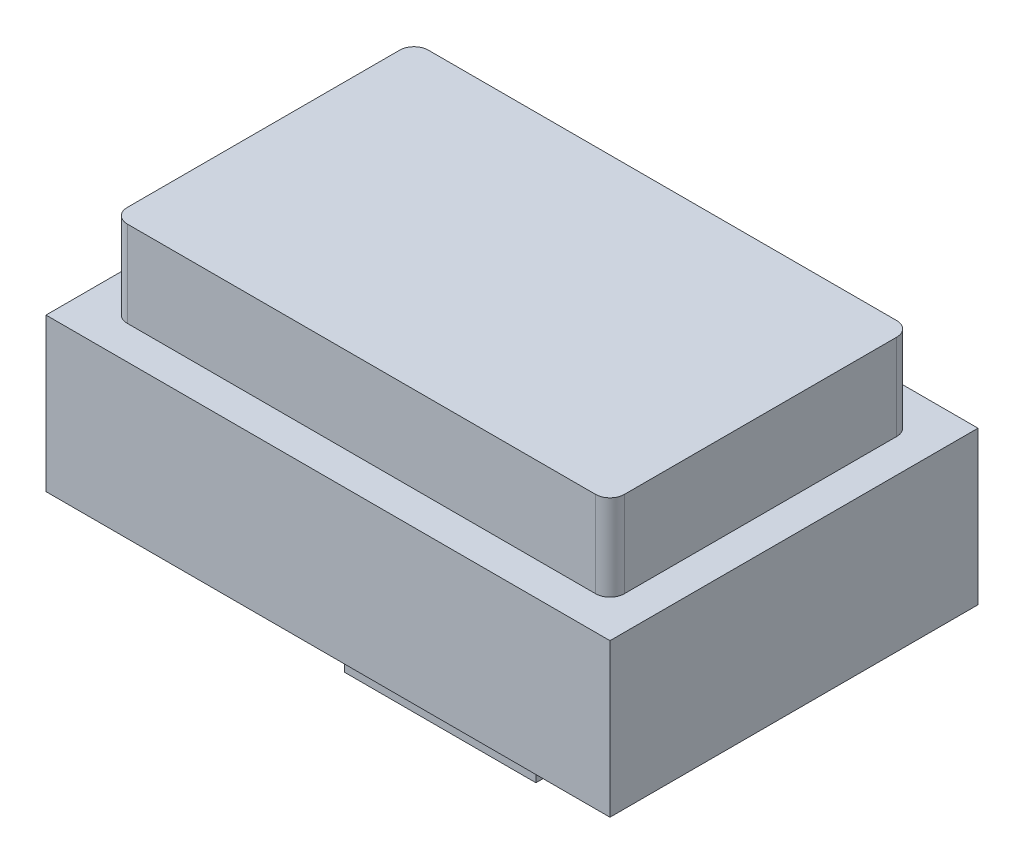
ISO-10303-21;
HEADER;
FILE_DESCRIPTION(('STEP AP214'),'2;1');
FILE_NAME('part.step','',(''),(''),'','','');
FILE_SCHEMA(('AUTOMOTIVE_DESIGN { 1 0 10303 214 1 1 1 1 }'));
ENDSEC;
DATA;
#1=APPLICATION_CONTEXT('core data for automotive mechanical design processes');
#2=APPLICATION_PROTOCOL_DEFINITION('international standard','automotive_design',2000,#1);
#3=PRODUCT_CONTEXT('',#1,'mechanical');
#4=PRODUCT('Part','Part','',(#3));
#5=PRODUCT_RELATED_PRODUCT_CATEGORY('part','',(#4));
#6=PRODUCT_DEFINITION_FORMATION('','',#4);
#7=PRODUCT_DEFINITION_CONTEXT('part definition',#1,'design');
#8=PRODUCT_DEFINITION('design','',#6,#7);
#9=PRODUCT_DEFINITION_SHAPE('','',#8);
#10=(LENGTH_UNIT() NAMED_UNIT(*) SI_UNIT(.MILLI.,.METRE.));
#11=(NAMED_UNIT(*) PLANE_ANGLE_UNIT() SI_UNIT($,.RADIAN.));
#12=(NAMED_UNIT(*) SI_UNIT($,.STERADIAN.) SOLID_ANGLE_UNIT());
#13=UNCERTAINTY_MEASURE_WITH_UNIT(LENGTH_MEASURE(1.E-05),#10,'distance_accuracy_value','');
#14=(GEOMETRIC_REPRESENTATION_CONTEXT(3) GLOBAL_UNCERTAINTY_ASSIGNED_CONTEXT((#13)) GLOBAL_UNIT_ASSIGNED_CONTEXT((#10,
#11,#12)) REPRESENTATION_CONTEXT('',''));
#15=CARTESIAN_POINT('',(0.,0.,0.));
#16=DIRECTION('',(0.,0.,1.));
#17=DIRECTION('',(1.,0.,0.));
#18=AXIS2_PLACEMENT_3D('',#15,#16,#17);
#19=CARTESIAN_POINT('',(0.,-3.2,0.));
#20=DIRECTION('',(0.,-1.,0.));
#21=DIRECTION('',(0.,0.,-1.));
#22=AXIS2_PLACEMENT_3D('',#19,#20,#21);
#23=PLANE('',#22);
#24=DIRECTION('',(0.,0.,1.));
#25=VECTOR('',#24,1.);
#26=CARTESIAN_POINT('',(5.9,-3.2,3.85));
#27=LINE('',#26,#25);
#28=CARTESIAN_POINT('',(5.9,-3.2,-3.85));
#29=VERTEX_POINT('',#28);
#30=CARTESIAN_POINT('',(5.9,-3.2,3.85));
#31=VERTEX_POINT('',#30);
#32=EDGE_CURVE('E178',#29,#31,#27,.T.);
#33=ORIENTED_EDGE('',*,*,#32,.T.);
#34=DIRECTION('',(-1.,0.,0.));
#35=VECTOR('',#34,1.);
#36=CARTESIAN_POINT('',(-5.9,-3.2,3.85));
#37=LINE('',#36,#35);
#38=CARTESIAN_POINT('',(-5.9,-3.2,3.85));
#39=VERTEX_POINT('',#38);
#40=EDGE_CURVE('E181',#31,#39,#37,.T.);
#41=ORIENTED_EDGE('',*,*,#40,.T.);
#42=DIRECTION('',(0.,0.,-1.));
#43=VECTOR('',#42,1.);
#44=CARTESIAN_POINT('',(-5.9,-3.2,3.85));
#45=LINE('',#44,#43);
#46=CARTESIAN_POINT('',(-5.9,-3.2,-3.85));
#47=VERTEX_POINT('',#46);
#48=EDGE_CURVE('E184',#39,#47,#45,.T.);
#49=ORIENTED_EDGE('',*,*,#48,.T.);
#50=DIRECTION('',(1.,0.,0.));
#51=VECTOR('',#50,1.);
#52=CARTESIAN_POINT('',(-5.9,-3.2,-3.85));
#53=LINE('',#52,#51);
#54=EDGE_CURVE('E186',#47,#29,#53,.T.);
#55=ORIENTED_EDGE('',*,*,#54,.T.);
#56=EDGE_LOOP('',(#33,#41,#49,#55));
#57=FACE_BOUND('',#56,.T.);
#58=DIRECTION('',(-1.,0.,0.));
#59=VECTOR('',#58,1.);
#60=CARTESIAN_POINT('',(-2.,-3.2,1.5));
#61=LINE('',#60,#59);
#62=CARTESIAN_POINT('',(2.,-3.2,1.5));
#63=VERTEX_POINT('',#62);
#64=CARTESIAN_POINT('',(-2.,-3.2,1.5));
#65=VERTEX_POINT('',#64);
#66=EDGE_CURVE('E459',#63,#65,#61,.T.);
#67=ORIENTED_EDGE('',*,*,#66,.F.);
#68=DIRECTION('',(0.,0.,1.));
#69=VECTOR('',#68,1.);
#70=CARTESIAN_POINT('',(2.,-3.2,1.5));
#71=LINE('',#70,#69);
#72=CARTESIAN_POINT('',(2.,-3.2,-1.5));
#73=VERTEX_POINT('',#72);
#74=EDGE_CURVE('E168',#73,#63,#71,.T.);
#75=ORIENTED_EDGE('',*,*,#74,.F.);
#76=DIRECTION('',(1.,0.,0.));
#77=VECTOR('',#76,1.);
#78=CARTESIAN_POINT('',(-2.,-3.2,-1.5));
#79=LINE('',#78,#77);
#80=CARTESIAN_POINT('',(-2.,-3.2,-1.5));
#81=VERTEX_POINT('',#80);
#82=EDGE_CURVE('E164',#81,#73,#79,.T.);
#83=ORIENTED_EDGE('',*,*,#82,.F.);
#84=DIRECTION('',(0.,0.,-1.));
#85=VECTOR('',#84,1.);
#86=CARTESIAN_POINT('',(-2.,-3.2,1.5));
#87=LINE('',#86,#85);
#88=EDGE_CURVE('E456',#65,#81,#87,.T.);
#89=ORIENTED_EDGE('',*,*,#88,.F.);
#90=EDGE_LOOP('',(#67,#75,#83,#89));
#91=FACE_BOUND('',#90,.T.);
#92=ADVANCED_FACE('F32',(#57,#91),#23,.T.);
#93=CARTESIAN_POINT('',(5.2,1.8,-3.15));
#94=DIRECTION('',(-1.,0.,0.));
#95=DIRECTION('',(0.,0.,1.));
#96=AXIS2_PLACEMENT_3D('',#93,#94,#95);
#97=PLANE('',#96);
#98=DIRECTION('',(0.,0.,-1.));
#99=VECTOR('',#98,1.);
#100=CARTESIAN_POINT('',(5.2,1.8,-3.15));
#101=LINE('',#100,#99);
#102=CARTESIAN_POINT('',(5.2,1.8,2.85));
#103=VERTEX_POINT('',#102);
#104=CARTESIAN_POINT('',(5.2,1.8,-2.85));
#105=VERTEX_POINT('',#104);
#106=EDGE_CURVE('E205',#103,#105,#101,.T.);
#107=ORIENTED_EDGE('',*,*,#106,.F.);
#108=DIRECTION('',(0.,-1.,0.));
#109=VECTOR('',#108,1.);
#110=CARTESIAN_POINT('',(5.2,1.8,2.85));
#111=LINE('',#110,#109);
#112=CARTESIAN_POINT('',(5.2,0.,2.85));
#113=VERTEX_POINT('',#112);
#114=EDGE_CURVE('E255',#103,#113,#111,.T.);
#115=ORIENTED_EDGE('',*,*,#114,.T.);
#116=DIRECTION('',(0.,0.,-1.));
#117=VECTOR('',#116,1.);
#118=CARTESIAN_POINT('',(5.2,0.,-3.15));
#119=LINE('',#118,#117);
#120=CARTESIAN_POINT('',(5.2,0.,-2.85));
#121=VERTEX_POINT('',#120);
#122=EDGE_CURVE('E204',#113,#121,#119,.T.);
#123=ORIENTED_EDGE('',*,*,#122,.T.);
#124=DIRECTION('',(0.,-1.,0.));
#125=VECTOR('',#124,1.);
#126=CARTESIAN_POINT('',(5.2,1.8,-2.85));
#127=LINE('',#126,#125);
#128=EDGE_CURVE('E253',#121,#105,#127,.F.);
#129=ORIENTED_EDGE('',*,*,#128,.T.);
#130=EDGE_LOOP('',(#107,#115,#123,#129));
#131=FACE_BOUND('',#130,.T.);
#132=ADVANCED_FACE('F261',(#131),#97,.F.);
#133=CARTESIAN_POINT('',(-5.2,1.8,-3.15));
#134=DIRECTION('',(0.,0.,1.));
#135=DIRECTION('',(1.,0.,0.));
#136=AXIS2_PLACEMENT_3D('',#133,#134,#135);
#137=PLANE('',#136);
#138=DIRECTION('',(-1.,0.,0.));
#139=VECTOR('',#138,1.);
#140=CARTESIAN_POINT('',(-5.2,1.8,-3.15));
#141=LINE('',#140,#139);
#142=CARTESIAN_POINT('',(4.9,1.8,-3.15));
#143=VERTEX_POINT('',#142);
#144=CARTESIAN_POINT('',(-4.9,1.8,-3.15));
#145=VERTEX_POINT('',#144);
#146=EDGE_CURVE('E208',#143,#145,#141,.T.);
#147=ORIENTED_EDGE('',*,*,#146,.F.);
#148=DIRECTION('',(0.,-1.,0.));
#149=VECTOR('',#148,1.);
#150=CARTESIAN_POINT('',(4.9,1.8,-3.15));
#151=LINE('',#150,#149);
#152=CARTESIAN_POINT('',(4.9,0.,-3.15));
#153=VERTEX_POINT('',#152);
#154=EDGE_CURVE('E11',#143,#153,#151,.T.);
#155=ORIENTED_EDGE('',*,*,#154,.T.);
#156=DIRECTION('',(-1.,0.,0.));
#157=VECTOR('',#156,1.);
#158=CARTESIAN_POINT('',(-5.2,0.,-3.15));
#159=LINE('',#158,#157);
#160=CARTESIAN_POINT('',(-4.9,0.,-3.15));
#161=VERTEX_POINT('',#160);
#162=EDGE_CURVE('E219',#153,#161,#159,.T.);
#163=ORIENTED_EDGE('',*,*,#162,.T.);
#164=DIRECTION('',(0.,-1.,0.));
#165=VECTOR('',#164,1.);
#166=CARTESIAN_POINT('',(-4.9,1.8,-3.15));
#167=LINE('',#166,#165);
#168=EDGE_CURVE('E40',#161,#145,#167,.F.);
#169=ORIENTED_EDGE('',*,*,#168,.T.);
#170=EDGE_LOOP('',(#147,#155,#163,#169));
#171=FACE_BOUND('',#170,.T.);
#172=ADVANCED_FACE('F274',(#171),#137,.F.);
#173=CARTESIAN_POINT('',(-5.2,1.8,-3.15));
#174=DIRECTION('',(1.,0.,0.));
#175=DIRECTION('',(0.,0.,-1.));
#176=AXIS2_PLACEMENT_3D('',#173,#174,#175);
#177=PLANE('',#176);
#178=DIRECTION('',(0.,0.,1.));
#179=VECTOR('',#178,1.);
#180=CARTESIAN_POINT('',(-5.2,0.,-3.15));
#181=LINE('',#180,#179);
#182=CARTESIAN_POINT('',(-5.2,0.,-2.85));
#183=VERTEX_POINT('',#182);
#184=CARTESIAN_POINT('',(-5.2,0.,2.85));
#185=VERTEX_POINT('',#184);
#186=EDGE_CURVE('E221',#183,#185,#181,.T.);
#187=ORIENTED_EDGE('',*,*,#186,.T.);
#188=DIRECTION('',(0.,-1.,0.));
#189=VECTOR('',#188,1.);
#190=CARTESIAN_POINT('',(-5.2,1.8,2.85));
#191=LINE('',#190,#189);
#192=CARTESIAN_POINT('',(-5.2,1.8,2.85));
#193=VERTEX_POINT('',#192);
#194=EDGE_CURVE('E243',#185,#193,#191,.F.);
#195=ORIENTED_EDGE('',*,*,#194,.T.);
#196=DIRECTION('',(0.,0.,1.));
#197=VECTOR('',#196,1.);
#198=CARTESIAN_POINT('',(-5.2,1.8,-3.15));
#199=LINE('',#198,#197);
#200=CARTESIAN_POINT('',(-5.2,1.8,-2.85));
#201=VERTEX_POINT('',#200);
#202=EDGE_CURVE('E211',#201,#193,#199,.T.);
#203=ORIENTED_EDGE('',*,*,#202,.F.);
#204=DIRECTION('',(0.,-1.,0.));
#205=VECTOR('',#204,1.);
#206=CARTESIAN_POINT('',(-5.2,1.8,-2.85));
#207=LINE('',#206,#205);
#208=EDGE_CURVE('E240',#201,#183,#207,.T.);
#209=ORIENTED_EDGE('',*,*,#208,.T.);
#210=EDGE_LOOP('',(#187,#195,#203,#209));
#211=FACE_BOUND('',#210,.T.);
#212=ADVANCED_FACE('F283',(#211),#177,.F.);
#213=CARTESIAN_POINT('',(-5.2,1.8,3.15));
#214=DIRECTION('',(0.,0.,-1.));
#215=DIRECTION('',(-1.,0.,0.));
#216=AXIS2_PLACEMENT_3D('',#213,#214,#215);
#217=PLANE('',#216);
#218=DIRECTION('',(1.,0.,0.));
#219=VECTOR('',#218,1.);
#220=CARTESIAN_POINT('',(-5.2,1.8,3.15));
#221=LINE('',#220,#219);
#222=CARTESIAN_POINT('',(-4.9,1.8,3.15));
#223=VERTEX_POINT('',#222);
#224=CARTESIAN_POINT('',(4.9,1.8,3.15));
#225=VERTEX_POINT('',#224);
#226=EDGE_CURVE('E214',#223,#225,#221,.T.);
#227=ORIENTED_EDGE('',*,*,#226,.F.);
#228=DIRECTION('',(0.,-1.,0.));
#229=VECTOR('',#228,1.);
#230=CARTESIAN_POINT('',(-4.9,1.8,3.15));
#231=LINE('',#230,#229);
#232=CARTESIAN_POINT('',(-4.9,0.,3.15));
#233=VERTEX_POINT('',#232);
#234=EDGE_CURVE('E225',#223,#233,#231,.T.);
#235=ORIENTED_EDGE('',*,*,#234,.T.);
#236=DIRECTION('',(1.,0.,0.));
#237=VECTOR('',#236,1.);
#238=CARTESIAN_POINT('',(-5.2,0.,3.15));
#239=LINE('',#238,#237);
#240=CARTESIAN_POINT('',(4.9,0.,3.15));
#241=VERTEX_POINT('',#240);
#242=EDGE_CURVE('E209',#233,#241,#239,.T.);
#243=ORIENTED_EDGE('',*,*,#242,.T.);
#244=DIRECTION('',(0.,-1.,0.));
#245=VECTOR('',#244,1.);
#246=CARTESIAN_POINT('',(4.9,1.8,3.15));
#247=LINE('',#246,#245);
#248=EDGE_CURVE('E217',#241,#225,#247,.F.);
#249=ORIENTED_EDGE('',*,*,#248,.T.);
#250=EDGE_LOOP('',(#227,#235,#243,#249));
#251=FACE_BOUND('',#250,.T.);
#252=ADVANCED_FACE('F291',(#251),#217,.F.);
#253=CARTESIAN_POINT('',(0.,1.8,0.));
#254=DIRECTION('',(0.,1.,0.));
#255=DIRECTION('',(0.,0.,1.));
#256=AXIS2_PLACEMENT_3D('',#253,#254,#255);
#257=PLANE('',#256);
#258=ORIENTED_EDGE('',*,*,#202,.T.);
#259=CARTESIAN_POINT('',(-4.9,1.8,2.85));
#260=DIRECTION('',(0.,1.,0.));
#261=DIRECTION('',(0.,0.,1.));
#262=AXIS2_PLACEMENT_3D('',#259,#260,#261);
#263=CIRCLE('',#262,0.3);
#264=EDGE_CURVE('E251',#193,#223,#263,.T.);
#265=ORIENTED_EDGE('',*,*,#264,.T.);
#266=ORIENTED_EDGE('',*,*,#226,.T.);
#267=CARTESIAN_POINT('',(4.9,1.8,2.85));
#268=DIRECTION('',(0.,1.,0.));
#269=DIRECTION('',(0.,0.,1.));
#270=AXIS2_PLACEMENT_3D('',#267,#268,#269);
#271=CIRCLE('',#270,0.3);
#272=EDGE_CURVE('E249',#225,#103,#271,.T.);
#273=ORIENTED_EDGE('',*,*,#272,.T.);
#274=ORIENTED_EDGE('',*,*,#106,.T.);
#275=CARTESIAN_POINT('',(4.9,1.8,-2.85));
#276=DIRECTION('',(0.,1.,0.));
#277=DIRECTION('',(0.,0.,1.));
#278=AXIS2_PLACEMENT_3D('',#275,#276,#277);
#279=CIRCLE('',#278,0.3);
#280=EDGE_CURVE('E247',#105,#143,#279,.T.);
#281=ORIENTED_EDGE('',*,*,#280,.T.);
#282=ORIENTED_EDGE('',*,*,#146,.T.);
#283=CARTESIAN_POINT('',(-4.9,1.8,-2.85));
#284=DIRECTION('',(0.,1.,0.));
#285=DIRECTION('',(0.,0.,1.));
#286=AXIS2_PLACEMENT_3D('',#283,#284,#285);
#287=CIRCLE('',#286,0.3);
#288=EDGE_CURVE('E245',#145,#201,#287,.T.);
#289=ORIENTED_EDGE('',*,*,#288,.T.);
#290=EDGE_LOOP('',(#258,#265,#266,#273,#274,#281,#282,#289));
#291=FACE_BOUND('',#290,.T.);
#292=ADVANCED_FACE('F277',(#291),#257,.T.);
#293=CARTESIAN_POINT('',(-4.9,1.8,2.85));
#294=DIRECTION('',(0.,-1.,0.));
#295=DIRECTION('',(0.,0.,-1.));
#296=AXIS2_PLACEMENT_3D('',#293,#294,#295);
#297=CYLINDRICAL_SURFACE('',#296,0.3);
#298=ORIENTED_EDGE('',*,*,#264,.F.);
#299=ORIENTED_EDGE('',*,*,#194,.F.);
#300=CARTESIAN_POINT('',(-4.9,0.,2.85));
#301=DIRECTION('',(0.,1.,0.));
#302=DIRECTION('',(0.,0.,1.));
#303=AXIS2_PLACEMENT_3D('',#300,#301,#302);
#304=CIRCLE('',#303,0.3);
#305=EDGE_CURVE('E237',#233,#185,#304,.F.);
#306=ORIENTED_EDGE('',*,*,#305,.F.);
#307=ORIENTED_EDGE('',*,*,#234,.F.);
#308=EDGE_LOOP('',(#298,#299,#306,#307));
#309=FACE_BOUND('',#308,.T.);
#310=ADVANCED_FACE('F288',(#309),#297,.T.);
#311=CARTESIAN_POINT('',(4.9,1.8,2.85));
#312=DIRECTION('',(0.,-1.,0.));
#313=DIRECTION('',(0.,0.,-1.));
#314=AXIS2_PLACEMENT_3D('',#311,#312,#313);
#315=CYLINDRICAL_SURFACE('',#314,0.3);
#316=ORIENTED_EDGE('',*,*,#272,.F.);
#317=ORIENTED_EDGE('',*,*,#248,.F.);
#318=CARTESIAN_POINT('',(4.9,0.,2.85));
#319=DIRECTION('',(0.,1.,0.));
#320=DIRECTION('',(0.,0.,1.));
#321=AXIS2_PLACEMENT_3D('',#318,#319,#320);
#322=CIRCLE('',#321,0.3);
#323=EDGE_CURVE('E234',#113,#241,#322,.F.);
#324=ORIENTED_EDGE('',*,*,#323,.F.);
#325=ORIENTED_EDGE('',*,*,#114,.F.);
#326=EDGE_LOOP('',(#316,#317,#324,#325));
#327=FACE_BOUND('',#326,.T.);
#328=ADVANCED_FACE('F293',(#327),#315,.T.);
#329=CARTESIAN_POINT('',(4.9,1.8,-2.85));
#330=DIRECTION('',(0.,-1.,0.));
#331=DIRECTION('',(0.,0.,-1.));
#332=AXIS2_PLACEMENT_3D('',#329,#330,#331);
#333=CYLINDRICAL_SURFACE('',#332,0.3);
#334=ORIENTED_EDGE('',*,*,#280,.F.);
#335=ORIENTED_EDGE('',*,*,#128,.F.);
#336=CARTESIAN_POINT('',(4.9,0.,-2.85));
#337=DIRECTION('',(0.,1.,0.));
#338=DIRECTION('',(0.,0.,1.));
#339=AXIS2_PLACEMENT_3D('',#336,#337,#338);
#340=CIRCLE('',#339,0.3);
#341=EDGE_CURVE('E231',#153,#121,#340,.F.);
#342=ORIENTED_EDGE('',*,*,#341,.F.);
#343=ORIENTED_EDGE('',*,*,#154,.F.);
#344=EDGE_LOOP('',(#334,#335,#342,#343));
#345=FACE_BOUND('',#344,.T.);
#346=ADVANCED_FACE('F273',(#345),#333,.T.);
#347=CARTESIAN_POINT('',(-4.9,1.8,-2.85));
#348=DIRECTION('',(0.,-1.,0.));
#349=DIRECTION('',(0.,0.,-1.));
#350=AXIS2_PLACEMENT_3D('',#347,#348,#349);
#351=CYLINDRICAL_SURFACE('',#350,0.3);
#352=ORIENTED_EDGE('',*,*,#288,.F.);
#353=ORIENTED_EDGE('',*,*,#168,.F.);
#354=CARTESIAN_POINT('',(-4.9,0.,-2.85));
#355=DIRECTION('',(0.,1.,0.));
#356=DIRECTION('',(0.,0.,1.));
#357=AXIS2_PLACEMENT_3D('',#354,#355,#356);
#358=CIRCLE('',#357,0.3);
#359=EDGE_CURVE('E228',#183,#161,#358,.F.);
#360=ORIENTED_EDGE('',*,*,#359,.F.);
#361=ORIENTED_EDGE('',*,*,#208,.F.);
#362=EDGE_LOOP('',(#352,#353,#360,#361));
#363=FACE_BOUND('',#362,.T.);
#364=ADVANCED_FACE('F34',(#363),#351,.T.);
#365=CARTESIAN_POINT('',(5.9,-3.2,3.85));
#366=DIRECTION('',(-1.,0.,0.));
#367=DIRECTION('',(0.,0.,1.));
#368=AXIS2_PLACEMENT_3D('',#365,#366,#367);
#369=PLANE('',#368);
#370=DIRECTION('',(0.,0.,1.));
#371=VECTOR('',#370,1.);
#372=CARTESIAN_POINT('',(5.9,0.,3.85));
#373=LINE('',#372,#371);
#374=CARTESIAN_POINT('',(5.9,0.,-3.85));
#375=VERTEX_POINT('',#374);
#376=CARTESIAN_POINT('',(5.9,0.,3.85));
#377=VERTEX_POINT('',#376);
#378=EDGE_CURVE('E170',#375,#377,#373,.T.);
#379=ORIENTED_EDGE('',*,*,#378,.T.);
#380=DIRECTION('',(0.,1.,0.));
#381=VECTOR('',#380,1.);
#382=CARTESIAN_POINT('',(5.9,-3.2,3.85));
#383=LINE('',#382,#381);
#384=EDGE_CURVE('E201',#31,#377,#383,.T.);
#385=ORIENTED_EDGE('',*,*,#384,.F.);
#386=ORIENTED_EDGE('',*,*,#32,.F.);
#387=DIRECTION('',(0.,1.,0.));
#388=VECTOR('',#387,1.);
#389=CARTESIAN_POINT('',(5.9,-3.2,-3.85));
#390=LINE('',#389,#388);
#391=EDGE_CURVE('E187',#29,#375,#390,.T.);
#392=ORIENTED_EDGE('',*,*,#391,.T.);
#393=EDGE_LOOP('',(#379,#385,#386,#392));
#394=FACE_BOUND('',#393,.T.);
#395=ADVANCED_FACE('F325',(#394),#369,.F.);
#396=CARTESIAN_POINT('',(-5.9,-3.2,3.85));
#397=DIRECTION('',(0.,0.,-1.));
#398=DIRECTION('',(-1.,0.,0.));
#399=AXIS2_PLACEMENT_3D('',#396,#397,#398);
#400=PLANE('',#399);
#401=DIRECTION('',(-1.,0.,0.));
#402=VECTOR('',#401,1.);
#403=CARTESIAN_POINT('',(-5.9,0.,3.85));
#404=LINE('',#403,#402);
#405=CARTESIAN_POINT('',(-5.9,0.,3.85));
#406=VERTEX_POINT('',#405);
#407=EDGE_CURVE('E173',#377,#406,#404,.T.);
#408=ORIENTED_EDGE('',*,*,#407,.T.);
#409=DIRECTION('',(0.,1.,0.));
#410=VECTOR('',#409,1.);
#411=CARTESIAN_POINT('',(-5.9,-3.2,3.85));
#412=LINE('',#411,#410);
#413=EDGE_CURVE('E198',#39,#406,#412,.T.);
#414=ORIENTED_EDGE('',*,*,#413,.F.);
#415=ORIENTED_EDGE('',*,*,#40,.F.);
#416=ORIENTED_EDGE('',*,*,#384,.T.);
#417=EDGE_LOOP('',(#408,#414,#415,#416));
#418=FACE_BOUND('',#417,.T.);
#419=ADVANCED_FACE('F321',(#418),#400,.F.);
#420=CARTESIAN_POINT('',(-5.9,-3.2,3.85));
#421=DIRECTION('',(1.,0.,0.));
#422=DIRECTION('',(0.,0.,-1.));
#423=AXIS2_PLACEMENT_3D('',#420,#421,#422);
#424=PLANE('',#423);
#425=DIRECTION('',(0.,0.,-1.));
#426=VECTOR('',#425,1.);
#427=CARTESIAN_POINT('',(-5.9,0.,3.85));
#428=LINE('',#427,#426);
#429=CARTESIAN_POINT('',(-5.9,0.,-3.85));
#430=VERTEX_POINT('',#429);
#431=EDGE_CURVE('E190',#406,#430,#428,.T.);
#432=ORIENTED_EDGE('',*,*,#431,.T.);
#433=DIRECTION('',(0.,1.,0.));
#434=VECTOR('',#433,1.);
#435=CARTESIAN_POINT('',(-5.9,-3.2,-3.85));
#436=LINE('',#435,#434);
#437=EDGE_CURVE('E195',#47,#430,#436,.T.);
#438=ORIENTED_EDGE('',*,*,#437,.F.);
#439=ORIENTED_EDGE('',*,*,#48,.F.);
#440=ORIENTED_EDGE('',*,*,#413,.T.);
#441=EDGE_LOOP('',(#432,#438,#439,#440));
#442=FACE_BOUND('',#441,.T.);
#443=ADVANCED_FACE('F317',(#442),#424,.F.);
#444=CARTESIAN_POINT('',(-5.9,-3.2,-3.85));
#445=DIRECTION('',(0.,0.,1.));
#446=DIRECTION('',(1.,0.,0.));
#447=AXIS2_PLACEMENT_3D('',#444,#445,#446);
#448=PLANE('',#447);
#449=DIRECTION('',(1.,0.,0.));
#450=VECTOR('',#449,1.);
#451=CARTESIAN_POINT('',(-5.9,0.,-3.85));
#452=LINE('',#451,#450);
#453=EDGE_CURVE('E182',#430,#375,#452,.T.);
#454=ORIENTED_EDGE('',*,*,#453,.T.);
#455=ORIENTED_EDGE('',*,*,#391,.F.);
#456=ORIENTED_EDGE('',*,*,#54,.F.);
#457=ORIENTED_EDGE('',*,*,#437,.T.);
#458=EDGE_LOOP('',(#454,#455,#456,#457));
#459=FACE_BOUND('',#458,.T.);
#460=ADVANCED_FACE('F314',(#459),#448,.F.);
#461=CARTESIAN_POINT('',(0.,0.,0.));
#462=DIRECTION('',(0.,-1.,0.));
#463=DIRECTION('',(0.,0.,-1.));
#464=AXIS2_PLACEMENT_3D('',#461,#462,#463);
#465=PLANE('',#464);
#466=ORIENTED_EDGE('',*,*,#323,.T.);
#467=ORIENTED_EDGE('',*,*,#242,.F.);
#468=ORIENTED_EDGE('',*,*,#305,.T.);
#469=ORIENTED_EDGE('',*,*,#186,.F.);
#470=ORIENTED_EDGE('',*,*,#359,.T.);
#471=ORIENTED_EDGE('',*,*,#162,.F.);
#472=ORIENTED_EDGE('',*,*,#341,.T.);
#473=ORIENTED_EDGE('',*,*,#122,.F.);
#474=EDGE_LOOP('',(#466,#467,#468,#469,#470,#471,#472,#473));
#475=FACE_BOUND('',#474,.T.);
#476=ORIENTED_EDGE('',*,*,#378,.F.);
#477=ORIENTED_EDGE('',*,*,#453,.F.);
#478=ORIENTED_EDGE('',*,*,#431,.F.);
#479=ORIENTED_EDGE('',*,*,#407,.F.);
#480=EDGE_LOOP('',(#476,#477,#478,#479));
#481=FACE_BOUND('',#480,.T.);
#482=ADVANCED_FACE('F266',(#475,#481),#465,.F.);
#483=CARTESIAN_POINT('',(2.,-5.7,1.5));
#484=DIRECTION('',(-1.,0.,0.));
#485=DIRECTION('',(0.,0.,1.));
#486=AXIS2_PLACEMENT_3D('',#483,#484,#485);
#487=PLANE('',#486);
#488=ORIENTED_EDGE('',*,*,#74,.T.);
#489=DIRECTION('',(0.,1.,0.));
#490=VECTOR('',#489,1.);
#491=CARTESIAN_POINT('',(2.,-5.7,1.5));
#492=LINE('',#491,#490);
#493=CARTESIAN_POINT('',(2.,-5.7,1.5));
#494=VERTEX_POINT('',#493);
#495=EDGE_CURVE('E149',#494,#63,#492,.T.);
#496=ORIENTED_EDGE('',*,*,#495,.F.);
#497=DIRECTION('',(0.,0.,1.));
#498=VECTOR('',#497,1.);
#499=CARTESIAN_POINT('',(2.,-5.7,1.5));
#500=LINE('',#499,#498);
#501=CARTESIAN_POINT('',(2.,-5.7,-1.5));
#502=VERTEX_POINT('',#501);
#503=EDGE_CURVE('E156',#502,#494,#500,.T.);
#504=ORIENTED_EDGE('',*,*,#503,.F.);
#505=DIRECTION('',(0.,1.,0.));
#506=VECTOR('',#505,1.);
#507=CARTESIAN_POINT('',(2.,-5.7,-1.5));
#508=LINE('',#507,#506);
#509=EDGE_CURVE('E454',#502,#73,#508,.T.);
#510=ORIENTED_EDGE('',*,*,#509,.T.);
#511=EDGE_LOOP('',(#488,#496,#504,#510));
#512=FACE_BOUND('',#511,.T.);
#513=ADVANCED_FACE('F166',(#512),#487,.F.);
#514=CARTESIAN_POINT('',(-2.,-5.7,1.5));
#515=DIRECTION('',(0.,0.,-1.));
#516=DIRECTION('',(-1.,0.,0.));
#517=AXIS2_PLACEMENT_3D('',#514,#515,#516);
#518=PLANE('',#517);
#519=ORIENTED_EDGE('',*,*,#66,.T.);
#520=DIRECTION('',(0.,1.,0.));
#521=VECTOR('',#520,1.);
#522=CARTESIAN_POINT('',(-2.,-5.7,1.5));
#523=LINE('',#522,#521);
#524=CARTESIAN_POINT('',(-2.,-5.7,1.5));
#525=VERTEX_POINT('',#524);
#526=EDGE_CURVE('E152',#525,#65,#523,.T.);
#527=ORIENTED_EDGE('',*,*,#526,.F.);
#528=DIRECTION('',(-1.,0.,0.));
#529=VECTOR('',#528,1.);
#530=CARTESIAN_POINT('',(-2.,-5.7,1.5));
#531=LINE('',#530,#529);
#532=EDGE_CURVE('E145',#494,#525,#531,.T.);
#533=ORIENTED_EDGE('',*,*,#532,.F.);
#534=ORIENTED_EDGE('',*,*,#495,.T.);
#535=EDGE_LOOP('',(#519,#527,#533,#534));
#536=FACE_BOUND('',#535,.T.);
#537=ADVANCED_FACE('F147',(#536),#518,.F.);
#538=CARTESIAN_POINT('',(-2.,-5.7,1.5));
#539=DIRECTION('',(1.,0.,0.));
#540=DIRECTION('',(0.,0.,-1.));
#541=AXIS2_PLACEMENT_3D('',#538,#539,#540);
#542=PLANE('',#541);
#543=ORIENTED_EDGE('',*,*,#88,.T.);
#544=DIRECTION('',(0.,1.,0.));
#545=VECTOR('',#544,1.);
#546=CARTESIAN_POINT('',(-2.,-5.7,-1.5));
#547=LINE('',#546,#545);
#548=CARTESIAN_POINT('',(-2.,-5.7,-1.5));
#549=VERTEX_POINT('',#548);
#550=EDGE_CURVE('E47',#549,#81,#547,.T.);
#551=ORIENTED_EDGE('',*,*,#550,.F.);
#552=DIRECTION('',(0.,0.,-1.));
#553=VECTOR('',#552,1.);
#554=CARTESIAN_POINT('',(-2.,-5.7,1.5));
#555=LINE('',#554,#553);
#556=EDGE_CURVE('E155',#525,#549,#555,.T.);
#557=ORIENTED_EDGE('',*,*,#556,.F.);
#558=ORIENTED_EDGE('',*,*,#526,.T.);
#559=EDGE_LOOP('',(#543,#551,#557,#558));
#560=FACE_BOUND('',#559,.T.);
#561=ADVANCED_FACE('F424',(#560),#542,.F.);
#562=CARTESIAN_POINT('',(-2.,-5.7,-1.5));
#563=DIRECTION('',(0.,0.,1.));
#564=DIRECTION('',(1.,0.,0.));
#565=AXIS2_PLACEMENT_3D('',#562,#563,#564);
#566=PLANE('',#565);
#567=ORIENTED_EDGE('',*,*,#82,.T.);
#568=ORIENTED_EDGE('',*,*,#509,.F.);
#569=DIRECTION('',(1.,0.,0.));
#570=VECTOR('',#569,1.);
#571=CARTESIAN_POINT('',(-2.,-5.7,-1.5));
#572=LINE('',#571,#570);
#573=EDGE_CURVE('E160',#549,#502,#572,.T.);
#574=ORIENTED_EDGE('',*,*,#573,.F.);
#575=ORIENTED_EDGE('',*,*,#550,.T.);
#576=EDGE_LOOP('',(#567,#568,#574,#575));
#577=FACE_BOUND('',#576,.T.);
#578=ADVANCED_FACE('F432',(#577),#566,.F.);
#579=CARTESIAN_POINT('',(0.,-5.7,0.));
#580=DIRECTION('',(0.,-1.,0.));
#581=DIRECTION('',(0.,0.,-1.));
#582=AXIS2_PLACEMENT_3D('',#579,#580,#581);
#583=PLANE('',#582);
#584=ORIENTED_EDGE('',*,*,#503,.T.);
#585=ORIENTED_EDGE('',*,*,#532,.T.);
#586=ORIENTED_EDGE('',*,*,#556,.T.);
#587=ORIENTED_EDGE('',*,*,#573,.T.);
#588=EDGE_LOOP('',(#584,#585,#586,#587));
#589=FACE_BOUND('',#588,.T.);
#590=ADVANCED_FACE('F159',(#589),#583,.T.);
#591=CLOSED_SHELL('',(#92,#132,#172,#212,#252,#292,#310,#328,#346,#364,#395,#419,#443,#460,#482,
#513,#537,#561,#578,#590));
#592=MANIFOLD_SOLID_BREP('B2',#591);
#593=ADVANCED_BREP_SHAPE_REPRESENTATION('',(#18,#592),#14);
#594=SHAPE_DEFINITION_REPRESENTATION(#9,#593);
ENDSEC;
END-ISO-10303-21;
